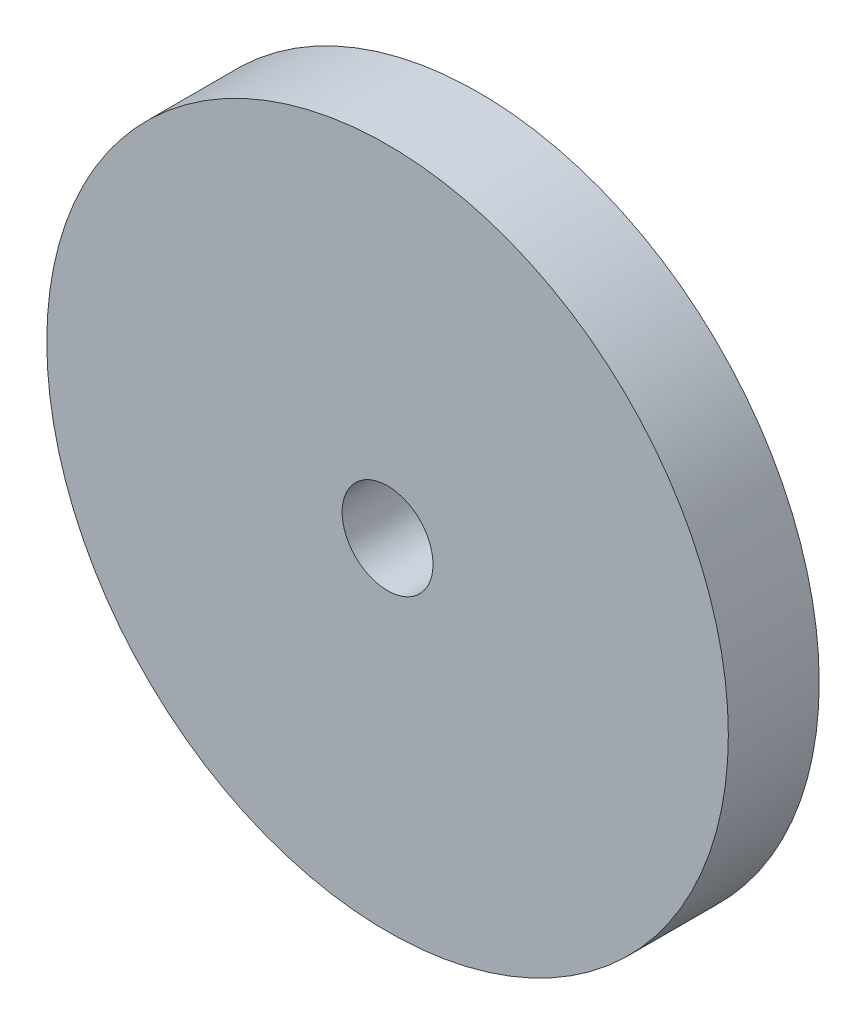
ISO-10303-21;
HEADER;
FILE_DESCRIPTION(('STEP AP214'),'2;1');
FILE_NAME('part.step','',(''),(''),'','','');
FILE_SCHEMA(('AUTOMOTIVE_DESIGN { 1 0 10303 214 1 1 1 1 }'));
ENDSEC;
DATA;
#1=APPLICATION_CONTEXT('core data for automotive mechanical design processes');
#2=APPLICATION_PROTOCOL_DEFINITION('international standard','automotive_design',2000,#1);
#3=PRODUCT_CONTEXT('',#1,'mechanical');
#4=PRODUCT('Part','Part','',(#3));
#5=PRODUCT_RELATED_PRODUCT_CATEGORY('part','',(#4));
#6=PRODUCT_DEFINITION_FORMATION('','',#4);
#7=PRODUCT_DEFINITION_CONTEXT('part definition',#1,'design');
#8=PRODUCT_DEFINITION('design','',#6,#7);
#9=PRODUCT_DEFINITION_SHAPE('','',#8);
#10=(LENGTH_UNIT() NAMED_UNIT(*) SI_UNIT(.MILLI.,.METRE.));
#11=(NAMED_UNIT(*) PLANE_ANGLE_UNIT() SI_UNIT($,.RADIAN.));
#12=(NAMED_UNIT(*) SI_UNIT($,.STERADIAN.) SOLID_ANGLE_UNIT());
#13=UNCERTAINTY_MEASURE_WITH_UNIT(LENGTH_MEASURE(1.E-05),#10,'distance_accuracy_value','');
#14=(GEOMETRIC_REPRESENTATION_CONTEXT(3) GLOBAL_UNCERTAINTY_ASSIGNED_CONTEXT((#13)) GLOBAL_UNIT_ASSIGNED_CONTEXT((#10,
#11,#12)) REPRESENTATION_CONTEXT('',''));
#15=CARTESIAN_POINT('',(0.,0.,0.));
#16=DIRECTION('',(0.,0.,1.));
#17=DIRECTION('',(1.,0.,0.));
#18=AXIS2_PLACEMENT_3D('',#15,#16,#17);
#19=CARTESIAN_POINT('',(0.,0.,2.));
#20=DIRECTION('',(0.,0.,1.));
#21=DIRECTION('',(1.,0.,0.));
#22=AXIS2_PLACEMENT_3D('',#19,#20,#21);
#23=PLANE('',#22);
#24=CARTESIAN_POINT('',(0.,0.,2.));
#25=DIRECTION('',(0.,0.,1.));
#26=DIRECTION('',(1.,0.,0.));
#27=AXIS2_PLACEMENT_3D('',#24,#25,#26);
#28=CIRCLE('',#27,7.5);
#29=CARTESIAN_POINT('',(7.5,0.,2.));
#30=VERTEX_POINT('',#29);
#31=EDGE_CURVE('E10',#30,#30,#28,.T.);
#32=ORIENTED_EDGE('',*,*,#31,.T.);
#33=EDGE_LOOP('',(#32));
#34=FACE_BOUND('',#33,.T.);
#35=CARTESIAN_POINT('',(0.,0.,2.));
#36=DIRECTION('',(0.,0.,1.));
#37=DIRECTION('',(1.,0.,0.));
#38=AXIS2_PLACEMENT_3D('',#35,#36,#37);
#39=CIRCLE('',#38,1.);
#40=CARTESIAN_POINT('',(1.,0.,2.));
#41=VERTEX_POINT('',#40);
#42=EDGE_CURVE('E42',#41,#41,#39,.T.);
#43=ORIENTED_EDGE('',*,*,#42,.F.);
#44=EDGE_LOOP('',(#43));
#45=FACE_BOUND('',#44,.T.);
#46=ADVANCED_FACE('F31',(#34,#45),#23,.T.);
#47=CARTESIAN_POINT('',(0.,0.,0.));
#48=DIRECTION('',(0.,0.,1.));
#49=DIRECTION('',(1.,0.,0.));
#50=AXIS2_PLACEMENT_3D('',#47,#48,#49);
#51=PLANE('',#50);
#52=CARTESIAN_POINT('',(0.,0.,0.));
#53=DIRECTION('',(0.,0.,1.));
#54=DIRECTION('',(1.,0.,0.));
#55=AXIS2_PLACEMENT_3D('',#52,#53,#54);
#56=CIRCLE('',#55,7.5);
#57=CARTESIAN_POINT('',(7.5,0.,0.));
#58=VERTEX_POINT('',#57);
#59=EDGE_CURVE('E35',#58,#58,#56,.T.);
#60=ORIENTED_EDGE('',*,*,#59,.F.);
#61=EDGE_LOOP('',(#60));
#62=FACE_BOUND('',#61,.T.);
#63=CARTESIAN_POINT('',(0.,0.,0.));
#64=DIRECTION('',(0.,0.,1.));
#65=DIRECTION('',(1.,0.,0.));
#66=AXIS2_PLACEMENT_3D('',#63,#64,#65);
#67=CIRCLE('',#66,1.);
#68=CARTESIAN_POINT('',(1.,0.,0.));
#69=VERTEX_POINT('',#68);
#70=EDGE_CURVE('E44',#69,#69,#67,.T.);
#71=ORIENTED_EDGE('',*,*,#70,.T.);
#72=EDGE_LOOP('',(#71));
#73=FACE_BOUND('',#72,.T.);
#74=ADVANCED_FACE('F54',(#62,#73),#51,.F.);
#75=CARTESIAN_POINT('',(0.,0.,2.));
#76=DIRECTION('',(0.,0.,-1.));
#77=DIRECTION('',(-1.,0.,0.));
#78=AXIS2_PLACEMENT_3D('',#75,#76,#77);
#79=CYLINDRICAL_SURFACE('',#78,7.5);
#80=ORIENTED_EDGE('',*,*,#31,.F.);
#81=EDGE_LOOP('',(#80));
#82=FACE_BOUND('',#81,.T.);
#83=ORIENTED_EDGE('',*,*,#59,.T.);
#84=EDGE_LOOP('',(#83));
#85=FACE_BOUND('',#84,.T.);
#86=ADVANCED_FACE('F33',(#82,#85),#79,.T.);
#87=CARTESIAN_POINT('',(0.,0.,2.));
#88=DIRECTION('',(0.,0.,-1.));
#89=DIRECTION('',(-1.,0.,0.));
#90=AXIS2_PLACEMENT_3D('',#87,#88,#89);
#91=CYLINDRICAL_SURFACE('',#90,1.);
#92=ORIENTED_EDGE('',*,*,#42,.T.);
#93=EDGE_LOOP('',(#92));
#94=FACE_BOUND('',#93,.T.);
#95=ORIENTED_EDGE('',*,*,#70,.F.);
#96=EDGE_LOOP('',(#95));
#97=FACE_BOUND('',#96,.T.);
#98=ADVANCED_FACE('F50',(#94,#97),#91,.F.);
#99=CLOSED_SHELL('',(#46,#74,#86,#98));
#100=MANIFOLD_SOLID_BREP('B2',#99);
#101=ADVANCED_BREP_SHAPE_REPRESENTATION('',(#18,#100),#14);
#102=SHAPE_DEFINITION_REPRESENTATION(#9,#101);
ENDSEC;
END-ISO-10303-21;
